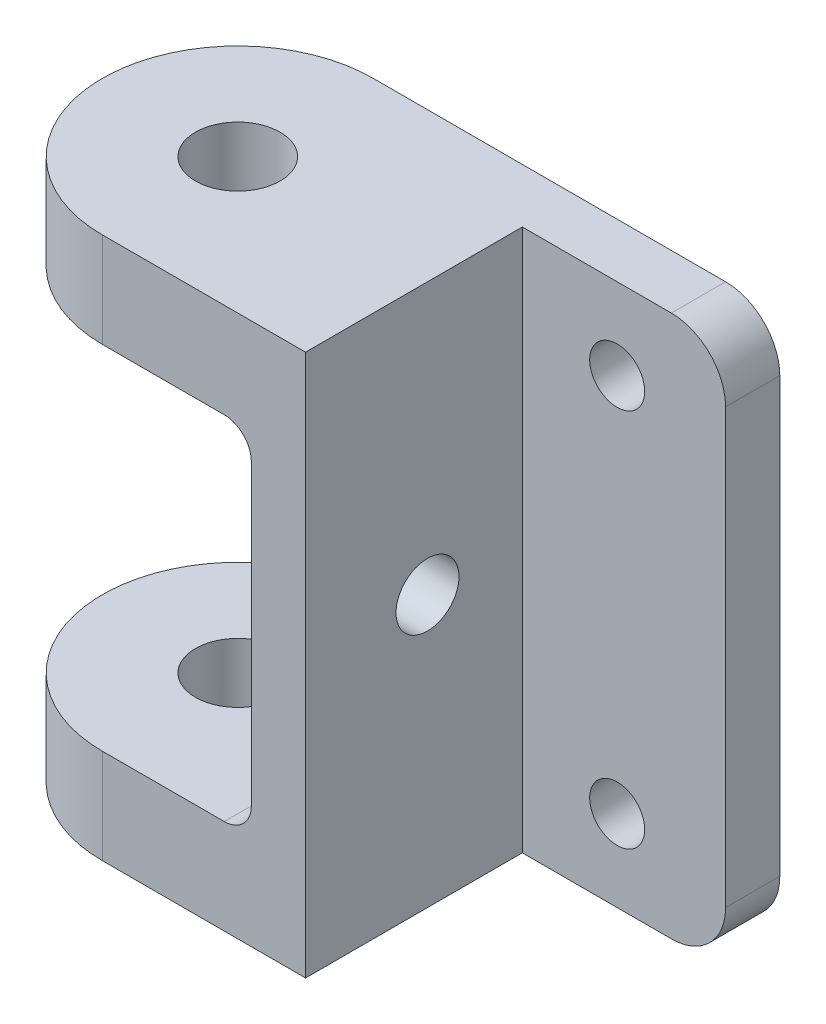
ISO-10303-21;
HEADER;
FILE_DESCRIPTION(('STEP AP214'),'2;1');
FILE_NAME('part.step','',(''),(''),'','','');
FILE_SCHEMA(('AUTOMOTIVE_DESIGN { 1 0 10303 214 1 1 1 1 }'));
ENDSEC;
DATA;
#1=APPLICATION_CONTEXT('core data for automotive mechanical design processes');
#2=APPLICATION_PROTOCOL_DEFINITION('international standard','automotive_design',2000,#1);
#3=PRODUCT_CONTEXT('',#1,'mechanical');
#4=PRODUCT('Part','Part','',(#3));
#5=PRODUCT_RELATED_PRODUCT_CATEGORY('part','',(#4));
#6=PRODUCT_DEFINITION_FORMATION('','',#4);
#7=PRODUCT_DEFINITION_CONTEXT('part definition',#1,'design');
#8=PRODUCT_DEFINITION('design','',#6,#7);
#9=PRODUCT_DEFINITION_SHAPE('','',#8);
#10=(LENGTH_UNIT() NAMED_UNIT(*) SI_UNIT(.MILLI.,.METRE.));
#11=(NAMED_UNIT(*) PLANE_ANGLE_UNIT() SI_UNIT($,.RADIAN.));
#12=(NAMED_UNIT(*) SI_UNIT($,.STERADIAN.) SOLID_ANGLE_UNIT());
#13=UNCERTAINTY_MEASURE_WITH_UNIT(LENGTH_MEASURE(1.E-05),#10,'distance_accuracy_value','');
#14=(GEOMETRIC_REPRESENTATION_CONTEXT(3) GLOBAL_UNCERTAINTY_ASSIGNED_CONTEXT((#13)) GLOBAL_UNIT_ASSIGNED_CONTEXT((#10,
#11,#12)) REPRESENTATION_CONTEXT('',''));
#15=CARTESIAN_POINT('',(0.,0.,0.));
#16=DIRECTION('',(0.,0.,1.));
#17=DIRECTION('',(1.,0.,0.));
#18=AXIS2_PLACEMENT_3D('',#15,#16,#17);
#19=CARTESIAN_POINT('',(-76.2,-101.6,25.4));
#20=DIRECTION('',(0.,1.,0.));
#21=DIRECTION('',(0.,0.,1.));
#22=AXIS2_PLACEMENT_3D('',#19,#20,#21);
#23=CYLINDRICAL_SURFACE('',#22,25.4);
#24=CARTESIAN_POINT('',(-76.2,-17.78,25.4));
#25=DIRECTION('',(0.,1.,0.));
#26=DIRECTION('',(-1.,0.,0.));
#27=AXIS2_PLACEMENT_3D('',#24,#25,#26);
#28=CIRCLE('',#27,25.4);
#29=CARTESIAN_POINT('',(-76.2,-17.78,50.8));
#30=VERTEX_POINT('',#29);
#31=CARTESIAN_POINT('',(-76.2,-17.78,0.));
#32=VERTEX_POINT('',#31);
#33=EDGE_CURVE('E191',#30,#32,#28,.F.);
#34=ORIENTED_EDGE('',*,*,#33,.F.);
#35=DIRECTION('',(0.,1.,0.));
#36=VECTOR('',#35,1.);
#37=CARTESIAN_POINT('',(-76.2,-101.6,50.8));
#38=LINE('',#37,#36);
#39=CARTESIAN_POINT('',(-76.2,0.,50.8));
#40=VERTEX_POINT('',#39);
#41=EDGE_CURVE('E237',#30,#40,#38,.T.);
#42=ORIENTED_EDGE('',*,*,#41,.T.);
#43=CARTESIAN_POINT('',(-76.2,0.,25.4));
#44=DIRECTION('',(0.,1.,0.));
#45=DIRECTION('',(0.,0.,1.));
#46=AXIS2_PLACEMENT_3D('',#43,#44,#45);
#47=CIRCLE('',#46,25.4);
#48=CARTESIAN_POINT('',(-76.2,0.,0.));
#49=VERTEX_POINT('',#48);
#50=EDGE_CURVE('E216',#49,#40,#47,.T.);
#51=ORIENTED_EDGE('',*,*,#50,.F.);
#52=DIRECTION('',(0.,1.,0.));
#53=VECTOR('',#52,1.);
#54=CARTESIAN_POINT('',(-76.2,-101.6,0.));
#55=LINE('',#54,#53);
#56=EDGE_CURVE('E240',#32,#49,#55,.T.);
#57=ORIENTED_EDGE('',*,*,#56,.F.);
#58=EDGE_LOOP('',(#34,#42,#51,#57));
#59=FACE_BOUND('',#58,.T.);
#60=ADVANCED_FACE('F34',(#59),#23,.T.);
#61=CARTESIAN_POINT('',(-76.2,-101.6,25.4));
#62=DIRECTION('',(0.,1.,0.));
#63=DIRECTION('',(0.,0.,1.));
#64=AXIS2_PLACEMENT_3D('',#61,#62,#63);
#65=CYLINDRICAL_SURFACE('',#64,7.93749999999999);
#66=CARTESIAN_POINT('',(-76.2,-17.78,25.4));
#67=DIRECTION('',(0.,1.,0.));
#68=DIRECTION('',(-1.,0.,0.));
#69=AXIS2_PLACEMENT_3D('',#66,#67,#68);
#70=CIRCLE('',#69,7.93749999999999);
#71=CARTESIAN_POINT('',(-84.1375,-17.78,25.4));
#72=VERTEX_POINT('',#71);
#73=EDGE_CURVE('E190',#72,#72,#70,.F.);
#74=ORIENTED_EDGE('',*,*,#73,.T.);
#75=EDGE_LOOP('',(#74));
#76=FACE_BOUND('',#75,.T.);
#77=CARTESIAN_POINT('',(-76.2,0.,25.4));
#78=DIRECTION('',(0.,1.,0.));
#79=DIRECTION('',(0.,0.,1.));
#80=AXIS2_PLACEMENT_3D('',#77,#78,#79);
#81=CIRCLE('',#80,7.93749999999999);
#82=CARTESIAN_POINT('',(-76.2,0.,33.3375));
#83=VERTEX_POINT('',#82);
#84=EDGE_CURVE('E193',#83,#83,#81,.T.);
#85=ORIENTED_EDGE('',*,*,#84,.T.);
#86=EDGE_LOOP('',(#85));
#87=FACE_BOUND('',#86,.T.);
#88=ADVANCED_FACE('F318',(#76,#87),#65,.F.);
#89=CARTESIAN_POINT('',(0.,-101.6,10.16));
#90=DIRECTION('',(1.,0.,0.));
#91=DIRECTION('',(0.,0.,-1.));
#92=AXIS2_PLACEMENT_3D('',#89,#90,#91);
#93=PLANE('',#92);
#94=DIRECTION('',(0.,1.,0.));
#95=VECTOR('',#94,1.);
#96=CARTESIAN_POINT('',(0.,-101.6,0.));
#97=LINE('',#96,#95);
#98=CARTESIAN_POINT('',(0.,-91.44,0.));
#99=VERTEX_POINT('',#98);
#100=CARTESIAN_POINT('',(0.,-10.16,0.));
#101=VERTEX_POINT('',#100);
#102=EDGE_CURVE('E214',#99,#101,#97,.T.);
#103=ORIENTED_EDGE('',*,*,#102,.T.);
#104=DIRECTION('',(0.,0.,-1.));
#105=VECTOR('',#104,1.);
#106=CARTESIAN_POINT('',(0.,-10.16,10.16));
#107=LINE('',#106,#105);
#108=CARTESIAN_POINT('',(0.,-10.16,10.16));
#109=VERTEX_POINT('',#108);
#110=EDGE_CURVE('E55',#101,#109,#107,.F.);
#111=ORIENTED_EDGE('',*,*,#110,.T.);
#112=DIRECTION('',(0.,1.,0.));
#113=VECTOR('',#112,1.);
#114=CARTESIAN_POINT('',(0.,-101.6,10.16));
#115=LINE('',#114,#113);
#116=CARTESIAN_POINT('',(0.,-91.44,10.16));
#117=VERTEX_POINT('',#116);
#118=EDGE_CURVE('E227',#117,#109,#115,.T.);
#119=ORIENTED_EDGE('',*,*,#118,.F.);
#120=DIRECTION('',(0.,0.,-1.));
#121=VECTOR('',#120,1.);
#122=CARTESIAN_POINT('',(0.,-91.44,0.));
#123=LINE('',#122,#121);
#124=EDGE_CURVE('E257',#117,#99,#123,.T.);
#125=ORIENTED_EDGE('',*,*,#124,.T.);
#126=EDGE_LOOP('',(#103,#111,#119,#125));
#127=FACE_BOUND('',#126,.T.);
#128=ADVANCED_FACE('F274',(#127),#93,.T.);
#129=CARTESIAN_POINT('',(-38.1,-101.6,10.16));
#130=DIRECTION('',(0.,0.,1.));
#131=DIRECTION('',(1.,0.,0.));
#132=AXIS2_PLACEMENT_3D('',#129,#130,#131);
#133=PLANE('',#132);
#134=CARTESIAN_POINT('',(-20.32,-15.24,10.16));
#135=DIRECTION('',(0.,0.,1.));
#136=DIRECTION('',(1.,0.,0.));
#137=AXIS2_PLACEMENT_3D('',#134,#135,#136);
#138=CIRCLE('',#137,5.1562);
#139=CARTESIAN_POINT('',(-15.1638,-15.24,10.16));
#140=VERTEX_POINT('',#139);
#141=EDGE_CURVE('E507',#140,#140,#138,.T.);
#142=ORIENTED_EDGE('',*,*,#141,.F.);
#143=EDGE_LOOP('',(#142));
#144=FACE_BOUND('',#143,.T.);
#145=CARTESIAN_POINT('',(-20.3199999999993,-86.36,10.16));
#146=DIRECTION('',(0.,0.,1.));
#147=DIRECTION('',(1.,0.,0.));
#148=AXIS2_PLACEMENT_3D('',#145,#146,#147);
#149=CIRCLE('',#148,5.1562);
#150=CARTESIAN_POINT('',(-15.1637999999993,-86.36,10.16));
#151=VERTEX_POINT('',#150);
#152=EDGE_CURVE('E249',#151,#151,#149,.T.);
#153=ORIENTED_EDGE('',*,*,#152,.F.);
#154=EDGE_LOOP('',(#153));
#155=FACE_BOUND('',#154,.T.);
#156=ORIENTED_EDGE('',*,*,#118,.T.);
#157=CARTESIAN_POINT('',(-10.16,-10.16,10.16));
#158=DIRECTION('',(0.,0.,1.));
#159=DIRECTION('',(1.,0.,0.));
#160=AXIS2_PLACEMENT_3D('',#157,#158,#159);
#161=CIRCLE('',#160,10.16);
#162=CARTESIAN_POINT('',(-10.16,0.,10.16));
#163=VERTEX_POINT('',#162);
#164=EDGE_CURVE('E42',#109,#163,#161,.T.);
#165=ORIENTED_EDGE('',*,*,#164,.T.);
#166=DIRECTION('',(1.,0.,0.));
#167=VECTOR('',#166,1.);
#168=CARTESIAN_POINT('',(-38.1,0.,10.16));
#169=LINE('',#168,#167);
#170=CARTESIAN_POINT('',(-38.1,0.,10.16));
#171=VERTEX_POINT('',#170);
#172=EDGE_CURVE('E203',#171,#163,#169,.T.);
#173=ORIENTED_EDGE('',*,*,#172,.F.);
#174=DIRECTION('',(0.,1.,0.));
#175=VECTOR('',#174,1.);
#176=CARTESIAN_POINT('',(-38.1,-101.6,10.16));
#177=LINE('',#176,#175);
#178=CARTESIAN_POINT('',(-38.1,-101.6,10.16));
#179=VERTEX_POINT('',#178);
#180=EDGE_CURVE('E230',#179,#171,#177,.T.);
#181=ORIENTED_EDGE('',*,*,#180,.F.);
#182=DIRECTION('',(1.,0.,0.));
#183=VECTOR('',#182,1.);
#184=CARTESIAN_POINT('',(-38.1,-101.6,10.16));
#185=LINE('',#184,#183);
#186=CARTESIAN_POINT('',(-10.16,-101.6,10.16));
#187=VERTEX_POINT('',#186);
#188=EDGE_CURVE('E212',#179,#187,#185,.T.);
#189=ORIENTED_EDGE('',*,*,#188,.T.);
#190=CARTESIAN_POINT('',(-10.16,-91.44,10.16));
#191=DIRECTION('',(0.,0.,1.));
#192=DIRECTION('',(1.,0.,0.));
#193=AXIS2_PLACEMENT_3D('',#190,#191,#192);
#194=CIRCLE('',#193,10.16);
#195=EDGE_CURVE('E261',#187,#117,#194,.T.);
#196=ORIENTED_EDGE('',*,*,#195,.T.);
#197=EDGE_LOOP('',(#156,#165,#173,#181,#189,#196));
#198=FACE_BOUND('',#197,.T.);
#199=ADVANCED_FACE('F265',(#144,#155,#198),#133,.T.);
#200=CARTESIAN_POINT('',(-38.1,-101.6,10.16));
#201=DIRECTION('',(1.,0.,0.));
#202=DIRECTION('',(0.,0.,-1.));
#203=AXIS2_PLACEMENT_3D('',#200,#201,#202);
#204=PLANE('',#203);
#205=CARTESIAN_POINT('',(-38.1,-50.8,27.94));
#206=DIRECTION('',(1.,0.,0.));
#207=DIRECTION('',(0.,0.,-1.));
#208=AXIS2_PLACEMENT_3D('',#205,#206,#207);
#209=CIRCLE('',#208,5.90340801137429);
#210=CARTESIAN_POINT('',(-38.1,-50.8,22.0365919886257));
#211=VERTEX_POINT('',#210);
#212=EDGE_CURVE('E250',#211,#211,#209,.T.);
#213=ORIENTED_EDGE('',*,*,#212,.F.);
#214=EDGE_LOOP('',(#213));
#215=FACE_BOUND('',#214,.T.);
#216=DIRECTION('',(0.,0.,-1.));
#217=VECTOR('',#216,1.);
#218=CARTESIAN_POINT('',(-38.1,0.,10.16));
#219=LINE('',#218,#217);
#220=CARTESIAN_POINT('',(-38.1,0.,50.8));
#221=VERTEX_POINT('',#220);
#222=EDGE_CURVE('E222',#221,#171,#219,.T.);
#223=ORIENTED_EDGE('',*,*,#222,.F.);
#224=DIRECTION('',(0.,1.,0.));
#225=VECTOR('',#224,1.);
#226=CARTESIAN_POINT('',(-38.1,-101.6,50.8));
#227=LINE('',#226,#225);
#228=CARTESIAN_POINT('',(-38.1,-101.6,50.8));
#229=VERTEX_POINT('',#228);
#230=EDGE_CURVE('E232',#229,#221,#227,.T.);
#231=ORIENTED_EDGE('',*,*,#230,.F.);
#232=DIRECTION('',(0.,0.,-1.));
#233=VECTOR('',#232,1.);
#234=CARTESIAN_POINT('',(-38.1,-101.6,10.16));
#235=LINE('',#234,#233);
#236=EDGE_CURVE('E209',#229,#179,#235,.T.);
#237=ORIENTED_EDGE('',*,*,#236,.T.);
#238=ORIENTED_EDGE('',*,*,#180,.T.);
#239=EDGE_LOOP('',(#223,#231,#237,#238));
#240=FACE_BOUND('',#239,.T.);
#241=ADVANCED_FACE('F305',(#215,#240),#204,.T.);
#242=CARTESIAN_POINT('',(-76.2,-101.6,50.8));
#243=DIRECTION('',(0.,0.,1.));
#244=DIRECTION('',(1.,0.,0.));
#245=AXIS2_PLACEMENT_3D('',#242,#243,#244);
#246=PLANE('',#245);
#247=DIRECTION('',(-1.,0.,0.));
#248=VECTOR('',#247,1.);
#249=CARTESIAN_POINT('',(-53.34,-17.78,50.8));
#250=LINE('',#249,#248);
#251=CARTESIAN_POINT('',(-53.34,-17.78,50.8));
#252=VERTEX_POINT('',#251);
#253=EDGE_CURVE('E165',#252,#30,#250,.T.);
#254=ORIENTED_EDGE('',*,*,#253,.F.);
#255=CARTESIAN_POINT('',(-53.34,-22.86,50.8));
#256=DIRECTION('',(0.,0.,1.));
#257=DIRECTION('',(1.,0.,0.));
#258=AXIS2_PLACEMENT_3D('',#255,#256,#257);
#259=CIRCLE('',#258,5.08);
#260=CARTESIAN_POINT('',(-48.26,-22.86,50.8));
#261=VERTEX_POINT('',#260);
#262=EDGE_CURVE('E179',#261,#252,#259,.T.);
#263=ORIENTED_EDGE('',*,*,#262,.F.);
#264=DIRECTION('',(0.,1.,0.));
#265=VECTOR('',#264,1.);
#266=CARTESIAN_POINT('',(-48.26,-22.86,50.8));
#267=LINE('',#266,#265);
#268=CARTESIAN_POINT('',(-48.26,-78.74,50.8));
#269=VERTEX_POINT('',#268);
#270=EDGE_CURVE('E177',#269,#261,#267,.T.);
#271=ORIENTED_EDGE('',*,*,#270,.F.);
#272=CARTESIAN_POINT('',(-53.34,-78.74,50.8));
#273=DIRECTION('',(0.,0.,1.));
#274=DIRECTION('',(1.,0.,0.));
#275=AXIS2_PLACEMENT_3D('',#272,#273,#274);
#276=CIRCLE('',#275,5.08);
#277=CARTESIAN_POINT('',(-53.34,-83.82,50.8));
#278=VERTEX_POINT('',#277);
#279=EDGE_CURVE('E144',#278,#269,#276,.T.);
#280=ORIENTED_EDGE('',*,*,#279,.F.);
#281=DIRECTION('',(1.,0.,0.));
#282=VECTOR('',#281,1.);
#283=CARTESIAN_POINT('',(-53.34,-83.82,50.8));
#284=LINE('',#283,#282);
#285=CARTESIAN_POINT('',(-76.2,-83.82,50.8));
#286=VERTEX_POINT('',#285);
#287=EDGE_CURVE('E173',#286,#278,#284,.T.);
#288=ORIENTED_EDGE('',*,*,#287,.F.);
#289=CARTESIAN_POINT('',(-76.2,-101.6,50.8));
#290=VERTEX_POINT('',#289);
#291=EDGE_CURVE('E234',#290,#286,#38,.T.);
#292=ORIENTED_EDGE('',*,*,#291,.F.);
#293=DIRECTION('',(1.,0.,0.));
#294=VECTOR('',#293,1.);
#295=CARTESIAN_POINT('',(-76.2,-101.6,50.8));
#296=LINE('',#295,#294);
#297=EDGE_CURVE('E206',#290,#229,#296,.T.);
#298=ORIENTED_EDGE('',*,*,#297,.T.);
#299=ORIENTED_EDGE('',*,*,#230,.T.);
#300=DIRECTION('',(1.,0.,0.));
#301=VECTOR('',#300,1.);
#302=CARTESIAN_POINT('',(-76.2,0.,50.8));
#303=LINE('',#302,#301);
#304=EDGE_CURVE('E219',#40,#221,#303,.T.);
#305=ORIENTED_EDGE('',*,*,#304,.F.);
#306=ORIENTED_EDGE('',*,*,#41,.F.);
#307=EDGE_LOOP('',(#254,#263,#271,#280,#288,#292,#298,#299,#305,#306));
#308=FACE_BOUND('',#307,.T.);
#309=ADVANCED_FACE('F292',(#308),#246,.T.);
#310=CARTESIAN_POINT('',(-76.2,-83.82,25.4));
#311=DIRECTION('',(0.,-1.,0.));
#312=DIRECTION('',(1.,0.,0.));
#313=AXIS2_PLACEMENT_3D('',#310,#311,#312);
#314=CIRCLE('',#313,25.4);
#315=CARTESIAN_POINT('',(-76.2,-83.82,0.));
#316=VERTEX_POINT('',#315);
#317=EDGE_CURVE('E188',#316,#286,#314,.F.);
#318=ORIENTED_EDGE('',*,*,#317,.F.);
#319=CARTESIAN_POINT('',(-76.2,-101.6,0.));
#320=VERTEX_POINT('',#319);
#321=EDGE_CURVE('E238',#320,#316,#55,.T.);
#322=ORIENTED_EDGE('',*,*,#321,.F.);
#323=CARTESIAN_POINT('',(-76.2,-101.6,25.4));
#324=DIRECTION('',(0.,1.,0.));
#325=DIRECTION('',(0.,0.,1.));
#326=AXIS2_PLACEMENT_3D('',#323,#324,#325);
#327=CIRCLE('',#326,25.4);
#328=EDGE_CURVE('E202',#320,#290,#327,.T.);
#329=ORIENTED_EDGE('',*,*,#328,.T.);
#330=ORIENTED_EDGE('',*,*,#291,.T.);
#331=EDGE_LOOP('',(#318,#322,#329,#330));
#332=FACE_BOUND('',#331,.T.);
#333=ADVANCED_FACE('F285',(#332),#23,.T.);
#334=CARTESIAN_POINT('',(0.,-101.6,0.));
#335=DIRECTION('',(0.,0.,-1.));
#336=DIRECTION('',(-1.,0.,0.));
#337=AXIS2_PLACEMENT_3D('',#334,#335,#336);
#338=PLANE('',#337);
#339=CARTESIAN_POINT('',(-20.32,-15.24,0.));
#340=DIRECTION('',(0.,0.,1.));
#341=DIRECTION('',(1.,0.,0.));
#342=AXIS2_PLACEMENT_3D('',#339,#340,#341);
#343=CIRCLE('',#342,5.1562);
#344=CARTESIAN_POINT('',(-15.1638,-15.24,0.));
#345=VERTEX_POINT('',#344);
#346=EDGE_CURVE('E175',#345,#345,#343,.T.);
#347=ORIENTED_EDGE('',*,*,#346,.T.);
#348=EDGE_LOOP('',(#347));
#349=FACE_BOUND('',#348,.T.);
#350=CARTESIAN_POINT('',(-20.3199999999993,-86.36,0.));
#351=DIRECTION('',(0.,0.,1.));
#352=DIRECTION('',(1.,0.,0.));
#353=AXIS2_PLACEMENT_3D('',#350,#351,#352);
#354=CIRCLE('',#353,5.1562);
#355=CARTESIAN_POINT('',(-15.1637999999993,-86.36,0.));
#356=VERTEX_POINT('',#355);
#357=EDGE_CURVE('E503',#356,#356,#354,.T.);
#358=ORIENTED_EDGE('',*,*,#357,.T.);
#359=EDGE_LOOP('',(#358));
#360=FACE_BOUND('',#359,.T.);
#361=DIRECTION('',(-1.,0.,0.));
#362=VECTOR('',#361,1.);
#363=CARTESIAN_POINT('',(0.,0.,0.));
#364=LINE('',#363,#362);
#365=CARTESIAN_POINT('',(-10.16,0.,0.));
#366=VERTEX_POINT('',#365);
#367=EDGE_CURVE('E197',#366,#49,#364,.T.);
#368=ORIENTED_EDGE('',*,*,#367,.F.);
#369=CARTESIAN_POINT('',(-10.16,-10.16,0.));
#370=DIRECTION('',(0.,0.,-1.));
#371=DIRECTION('',(-1.,0.,0.));
#372=AXIS2_PLACEMENT_3D('',#369,#370,#371);
#373=CIRCLE('',#372,10.16);
#374=EDGE_CURVE('E255',#366,#101,#373,.T.);
#375=ORIENTED_EDGE('',*,*,#374,.T.);
#376=ORIENTED_EDGE('',*,*,#102,.F.);
#377=CARTESIAN_POINT('',(-10.16,-91.44,0.));
#378=DIRECTION('',(0.,0.,-1.));
#379=DIRECTION('',(-1.,0.,0.));
#380=AXIS2_PLACEMENT_3D('',#377,#378,#379);
#381=CIRCLE('',#380,10.16);
#382=CARTESIAN_POINT('',(-10.16,-101.6,0.));
#383=VERTEX_POINT('',#382);
#384=EDGE_CURVE('E253',#99,#383,#381,.T.);
#385=ORIENTED_EDGE('',*,*,#384,.T.);
#386=DIRECTION('',(-1.,0.,0.));
#387=VECTOR('',#386,1.);
#388=CARTESIAN_POINT('',(0.,-101.6,0.));
#389=LINE('',#388,#387);
#390=EDGE_CURVE('E200',#383,#320,#389,.T.);
#391=ORIENTED_EDGE('',*,*,#390,.T.);
#392=ORIENTED_EDGE('',*,*,#321,.T.);
#393=DIRECTION('',(1.,0.,0.));
#394=VECTOR('',#393,1.);
#395=CARTESIAN_POINT('',(-53.34,-83.82,0.));
#396=LINE('',#395,#394);
#397=CARTESIAN_POINT('',(-53.34,-83.82,0.));
#398=VERTEX_POINT('',#397);
#399=EDGE_CURVE('E163',#316,#398,#396,.T.);
#400=ORIENTED_EDGE('',*,*,#399,.T.);
#401=CARTESIAN_POINT('',(-53.34,-78.74,0.));
#402=DIRECTION('',(0.,0.,1.));
#403=DIRECTION('',(1.,0.,0.));
#404=AXIS2_PLACEMENT_3D('',#401,#402,#403);
#405=CIRCLE('',#404,5.08);
#406=CARTESIAN_POINT('',(-48.26,-78.74,0.));
#407=VERTEX_POINT('',#406);
#408=EDGE_CURVE('E141',#398,#407,#405,.T.);
#409=ORIENTED_EDGE('',*,*,#408,.T.);
#410=DIRECTION('',(0.,1.,0.));
#411=VECTOR('',#410,1.);
#412=CARTESIAN_POINT('',(-48.26,-22.86,0.));
#413=LINE('',#412,#411);
#414=CARTESIAN_POINT('',(-48.26,-22.86,0.));
#415=VERTEX_POINT('',#414);
#416=EDGE_CURVE('E152',#407,#415,#413,.T.);
#417=ORIENTED_EDGE('',*,*,#416,.T.);
#418=CARTESIAN_POINT('',(-53.34,-22.86,0.));
#419=DIRECTION('',(0.,0.,1.));
#420=DIRECTION('',(1.,0.,0.));
#421=AXIS2_PLACEMENT_3D('',#418,#419,#420);
#422=CIRCLE('',#421,5.08);
#423=CARTESIAN_POINT('',(-53.34,-17.78,0.));
#424=VERTEX_POINT('',#423);
#425=EDGE_CURVE('E157',#415,#424,#422,.T.);
#426=ORIENTED_EDGE('',*,*,#425,.T.);
#427=DIRECTION('',(-1.,0.,0.));
#428=VECTOR('',#427,1.);
#429=CARTESIAN_POINT('',(-53.34,-17.78,0.));
#430=LINE('',#429,#428);
#431=EDGE_CURVE('E170',#424,#32,#430,.T.);
#432=ORIENTED_EDGE('',*,*,#431,.T.);
#433=ORIENTED_EDGE('',*,*,#56,.T.);
#434=EDGE_LOOP('',(#368,#375,#376,#385,#391,#392,#400,#409,#417,#426,#432,#433));
#435=FACE_BOUND('',#434,.T.);
#436=ADVANCED_FACE('F161',(#349,#360,#435),#338,.T.);
#437=CARTESIAN_POINT('',(-76.2,-101.6,25.4));
#438=DIRECTION('',(0.,1.,0.));
#439=DIRECTION('',(0.,0.,1.));
#440=AXIS2_PLACEMENT_3D('',#437,#438,#439);
#441=PLANE('',#440);
#442=CARTESIAN_POINT('',(-76.2,-101.6,25.4));
#443=DIRECTION('',(0.,1.,0.));
#444=DIRECTION('',(0.,0.,1.));
#445=AXIS2_PLACEMENT_3D('',#442,#443,#444);
#446=CIRCLE('',#445,7.93749999999999);
#447=CARTESIAN_POINT('',(-76.2,-101.6,33.3375));
#448=VERTEX_POINT('',#447);
#449=EDGE_CURVE('E194',#448,#448,#446,.T.);
#450=ORIENTED_EDGE('',*,*,#449,.T.);
#451=EDGE_LOOP('',(#450));
#452=FACE_BOUND('',#451,.T.);
#453=ORIENTED_EDGE('',*,*,#390,.F.);
#454=DIRECTION('',(0.,0.,-1.));
#455=VECTOR('',#454,1.);
#456=CARTESIAN_POINT('',(-10.16,-101.6,10.16));
#457=LINE('',#456,#455);
#458=EDGE_CURVE('E11',#383,#187,#457,.F.);
#459=ORIENTED_EDGE('',*,*,#458,.T.);
#460=ORIENTED_EDGE('',*,*,#188,.F.);
#461=ORIENTED_EDGE('',*,*,#236,.F.);
#462=ORIENTED_EDGE('',*,*,#297,.F.);
#463=ORIENTED_EDGE('',*,*,#328,.F.);
#464=EDGE_LOOP('',(#453,#459,#460,#461,#462,#463));
#465=FACE_BOUND('',#464,.T.);
#466=ADVANCED_FACE('F280',(#452,#465),#441,.F.);
#467=CARTESIAN_POINT('',(-76.2,0.,25.4));
#468=DIRECTION('',(0.,1.,0.));
#469=DIRECTION('',(0.,0.,1.));
#470=AXIS2_PLACEMENT_3D('',#467,#468,#469);
#471=PLANE('',#470);
#472=ORIENTED_EDGE('',*,*,#84,.F.);
#473=EDGE_LOOP('',(#472));
#474=FACE_BOUND('',#473,.T.);
#475=ORIENTED_EDGE('',*,*,#172,.T.);
#476=DIRECTION('',(0.,0.,-1.));
#477=VECTOR('',#476,1.);
#478=CARTESIAN_POINT('',(-10.16,0.,25.4));
#479=LINE('',#478,#477);
#480=EDGE_CURVE('E229',#163,#366,#479,.T.);
#481=ORIENTED_EDGE('',*,*,#480,.T.);
#482=ORIENTED_EDGE('',*,*,#367,.T.);
#483=ORIENTED_EDGE('',*,*,#50,.T.);
#484=ORIENTED_EDGE('',*,*,#304,.T.);
#485=ORIENTED_EDGE('',*,*,#222,.T.);
#486=EDGE_LOOP('',(#475,#481,#482,#483,#484,#485));
#487=FACE_BOUND('',#486,.T.);
#488=ADVANCED_FACE('F269',(#474,#487),#471,.T.);
#489=CARTESIAN_POINT('',(-76.2,-83.82,25.4));
#490=DIRECTION('',(0.,-1.,0.));
#491=DIRECTION('',(1.,0.,0.));
#492=AXIS2_PLACEMENT_3D('',#489,#490,#491);
#493=CIRCLE('',#492,7.93749999999999);
#494=CARTESIAN_POINT('',(-68.2625,-83.82,25.4));
#495=VERTEX_POINT('',#494);
#496=EDGE_CURVE('E185',#495,#495,#493,.F.);
#497=ORIENTED_EDGE('',*,*,#496,.T.);
#498=EDGE_LOOP('',(#497));
#499=FACE_BOUND('',#498,.T.);
#500=ORIENTED_EDGE('',*,*,#449,.F.);
#501=EDGE_LOOP('',(#500));
#502=FACE_BOUND('',#501,.T.);
#503=ADVANCED_FACE('F325',(#499,#502),#65,.F.);
#504=CARTESIAN_POINT('',(-53.34,-17.78,0.));
#505=DIRECTION('',(0.,1.,0.));
#506=DIRECTION('',(-1.,0.,0.));
#507=AXIS2_PLACEMENT_3D('',#504,#505,#506);
#508=PLANE('',#507);
#509=ORIENTED_EDGE('',*,*,#33,.T.);
#510=ORIENTED_EDGE('',*,*,#431,.F.);
#511=DIRECTION('',(0.,0.,1.));
#512=VECTOR('',#511,1.);
#513=CARTESIAN_POINT('',(-53.34,-17.78,0.));
#514=LINE('',#513,#512);
#515=EDGE_CURVE('E183',#424,#252,#514,.T.);
#516=ORIENTED_EDGE('',*,*,#515,.T.);
#517=ORIENTED_EDGE('',*,*,#253,.T.);
#518=EDGE_LOOP('',(#509,#510,#516,#517));
#519=FACE_BOUND('',#518,.T.);
#520=ORIENTED_EDGE('',*,*,#73,.F.);
#521=EDGE_LOOP('',(#520));
#522=FACE_BOUND('',#521,.T.);
#523=ADVANCED_FACE('F362',(#519,#522),#508,.F.);
#524=CARTESIAN_POINT('',(-53.34,-83.82,0.));
#525=DIRECTION('',(0.,-1.,0.));
#526=DIRECTION('',(1.,0.,0.));
#527=AXIS2_PLACEMENT_3D('',#524,#525,#526);
#528=PLANE('',#527);
#529=ORIENTED_EDGE('',*,*,#317,.T.);
#530=ORIENTED_EDGE('',*,*,#287,.T.);
#531=DIRECTION('',(0.,0.,1.));
#532=VECTOR('',#531,1.);
#533=CARTESIAN_POINT('',(-53.34,-83.82,0.));
#534=LINE('',#533,#532);
#535=EDGE_CURVE('E149',#398,#278,#534,.T.);
#536=ORIENTED_EDGE('',*,*,#535,.F.);
#537=ORIENTED_EDGE('',*,*,#399,.F.);
#538=EDGE_LOOP('',(#529,#530,#536,#537));
#539=FACE_BOUND('',#538,.T.);
#540=ORIENTED_EDGE('',*,*,#496,.F.);
#541=EDGE_LOOP('',(#540));
#542=FACE_BOUND('',#541,.T.);
#543=ADVANCED_FACE('F288',(#539,#542),#528,.F.);
#544=CARTESIAN_POINT('',(-53.34,-22.86,0.));
#545=DIRECTION('',(0.,0.,1.));
#546=DIRECTION('',(1.,0.,0.));
#547=AXIS2_PLACEMENT_3D('',#544,#545,#546);
#548=CYLINDRICAL_SURFACE('',#547,5.08);
#549=ORIENTED_EDGE('',*,*,#262,.T.);
#550=ORIENTED_EDGE('',*,*,#515,.F.);
#551=ORIENTED_EDGE('',*,*,#425,.F.);
#552=DIRECTION('',(0.,0.,1.));
#553=VECTOR('',#552,1.);
#554=CARTESIAN_POINT('',(-48.26,-22.86,0.));
#555=LINE('',#554,#553);
#556=EDGE_CURVE('E148',#415,#261,#555,.T.);
#557=ORIENTED_EDGE('',*,*,#556,.T.);
#558=EDGE_LOOP('',(#549,#550,#551,#557));
#559=FACE_BOUND('',#558,.T.);
#560=ADVANCED_FACE('F296',(#559),#548,.F.);
#561=CARTESIAN_POINT('',(-48.26,-22.86,0.));
#562=DIRECTION('',(1.,0.,0.));
#563=DIRECTION('',(0.,0.,-1.));
#564=AXIS2_PLACEMENT_3D('',#561,#562,#563);
#565=PLANE('',#564);
#566=CARTESIAN_POINT('',(-48.26,-50.8,27.94));
#567=DIRECTION('',(1.,0.,0.));
#568=DIRECTION('',(0.,0.,-1.));
#569=AXIS2_PLACEMENT_3D('',#566,#567,#568);
#570=CIRCLE('',#569,5.90340801137429);
#571=CARTESIAN_POINT('',(-48.26,-50.8,22.0365919886257));
#572=VERTEX_POINT('',#571);
#573=EDGE_CURVE('E246',#572,#572,#570,.T.);
#574=ORIENTED_EDGE('',*,*,#573,.T.);
#575=EDGE_LOOP('',(#574));
#576=FACE_BOUND('',#575,.T.);
#577=ORIENTED_EDGE('',*,*,#270,.T.);
#578=ORIENTED_EDGE('',*,*,#556,.F.);
#579=ORIENTED_EDGE('',*,*,#416,.F.);
#580=DIRECTION('',(0.,0.,1.));
#581=VECTOR('',#580,1.);
#582=CARTESIAN_POINT('',(-48.26,-78.74,0.));
#583=LINE('',#582,#581);
#584=EDGE_CURVE('E136',#407,#269,#583,.T.);
#585=ORIENTED_EDGE('',*,*,#584,.T.);
#586=EDGE_LOOP('',(#577,#578,#579,#585));
#587=FACE_BOUND('',#586,.T.);
#588=ADVANCED_FACE('F153',(#576,#587),#565,.F.);
#589=CARTESIAN_POINT('',(-53.34,-78.74,0.));
#590=DIRECTION('',(0.,0.,1.));
#591=DIRECTION('',(1.,0.,0.));
#592=AXIS2_PLACEMENT_3D('',#589,#590,#591);
#593=CYLINDRICAL_SURFACE('',#592,5.08);
#594=ORIENTED_EDGE('',*,*,#279,.T.);
#595=ORIENTED_EDGE('',*,*,#584,.F.);
#596=ORIENTED_EDGE('',*,*,#408,.F.);
#597=ORIENTED_EDGE('',*,*,#535,.T.);
#598=EDGE_LOOP('',(#594,#595,#596,#597));
#599=FACE_BOUND('',#598,.T.);
#600=ADVANCED_FACE('F138',(#599),#593,.F.);
#601=CARTESIAN_POINT('',(-20.3199999999993,-86.36,0.));
#602=DIRECTION('',(0.,0.,1.));
#603=DIRECTION('',(1.,0.,0.));
#604=AXIS2_PLACEMENT_3D('',#601,#602,#603);
#605=CYLINDRICAL_SURFACE('',#604,5.1562);
#606=ORIENTED_EDGE('',*,*,#357,.F.);
#607=EDGE_LOOP('',(#606));
#608=FACE_BOUND('',#607,.T.);
#609=ORIENTED_EDGE('',*,*,#152,.T.);
#610=EDGE_LOOP('',(#609));
#611=FACE_BOUND('',#610,.T.);
#612=ADVANCED_FACE('F353',(#608,#611),#605,.F.);
#613=CARTESIAN_POINT('',(-20.32,-15.24,0.));
#614=DIRECTION('',(0.,0.,1.));
#615=DIRECTION('',(1.,0.,0.));
#616=AXIS2_PLACEMENT_3D('',#613,#614,#615);
#617=CYLINDRICAL_SURFACE('',#616,5.1562);
#618=ORIENTED_EDGE('',*,*,#346,.F.);
#619=EDGE_LOOP('',(#618));
#620=FACE_BOUND('',#619,.T.);
#621=ORIENTED_EDGE('',*,*,#141,.T.);
#622=EDGE_LOOP('',(#621));
#623=FACE_BOUND('',#622,.T.);
#624=ADVANCED_FACE('F347',(#620,#623),#617,.F.);
#625=CARTESIAN_POINT('',(-101.6,-50.8,27.94));
#626=DIRECTION('',(1.,0.,0.));
#627=DIRECTION('',(0.,0.,-1.));
#628=AXIS2_PLACEMENT_3D('',#625,#626,#627);
#629=CYLINDRICAL_SURFACE('',#628,5.90340801137429);
#630=ORIENTED_EDGE('',*,*,#212,.T.);
#631=EDGE_LOOP('',(#630));
#632=FACE_BOUND('',#631,.T.);
#633=ORIENTED_EDGE('',*,*,#573,.F.);
#634=EDGE_LOOP('',(#633));
#635=FACE_BOUND('',#634,.T.);
#636=ADVANCED_FACE('F342',(#632,#635),#629,.F.);
#637=CARTESIAN_POINT('',(-10.16,-10.16,25.4));
#638=DIRECTION('',(0.,0.,-1.));
#639=DIRECTION('',(-1.,0.,0.));
#640=AXIS2_PLACEMENT_3D('',#637,#638,#639);
#641=CYLINDRICAL_SURFACE('',#640,10.16);
#642=ORIENTED_EDGE('',*,*,#164,.F.);
#643=ORIENTED_EDGE('',*,*,#110,.F.);
#644=ORIENTED_EDGE('',*,*,#374,.F.);
#645=ORIENTED_EDGE('',*,*,#480,.F.);
#646=EDGE_LOOP('',(#642,#643,#644,#645));
#647=FACE_BOUND('',#646,.T.);
#648=ADVANCED_FACE('F271',(#647),#641,.T.);
#649=CARTESIAN_POINT('',(-10.16,-91.44,10.16));
#650=DIRECTION('',(0.,0.,1.));
#651=DIRECTION('',(1.,0.,0.));
#652=AXIS2_PLACEMENT_3D('',#649,#650,#651);
#653=CYLINDRICAL_SURFACE('',#652,10.16);
#654=ORIENTED_EDGE('',*,*,#195,.F.);
#655=ORIENTED_EDGE('',*,*,#458,.F.);
#656=ORIENTED_EDGE('',*,*,#384,.F.);
#657=ORIENTED_EDGE('',*,*,#124,.F.);
#658=EDGE_LOOP('',(#654,#655,#656,#657));
#659=FACE_BOUND('',#658,.T.);
#660=ADVANCED_FACE('F36',(#659),#653,.T.);
#661=CLOSED_SHELL('',(#60,#88,#128,#199,#241,#309,#333,#436,#466,#488,#503,#523,#543,#560,#588,
#600,#612,#624,#636,#648,#660));
#662=MANIFOLD_SOLID_BREP('B2',#661);
#663=ADVANCED_BREP_SHAPE_REPRESENTATION('',(#18,#662),#14);
#664=SHAPE_DEFINITION_REPRESENTATION(#9,#663);
ENDSEC;
END-ISO-10303-21;
